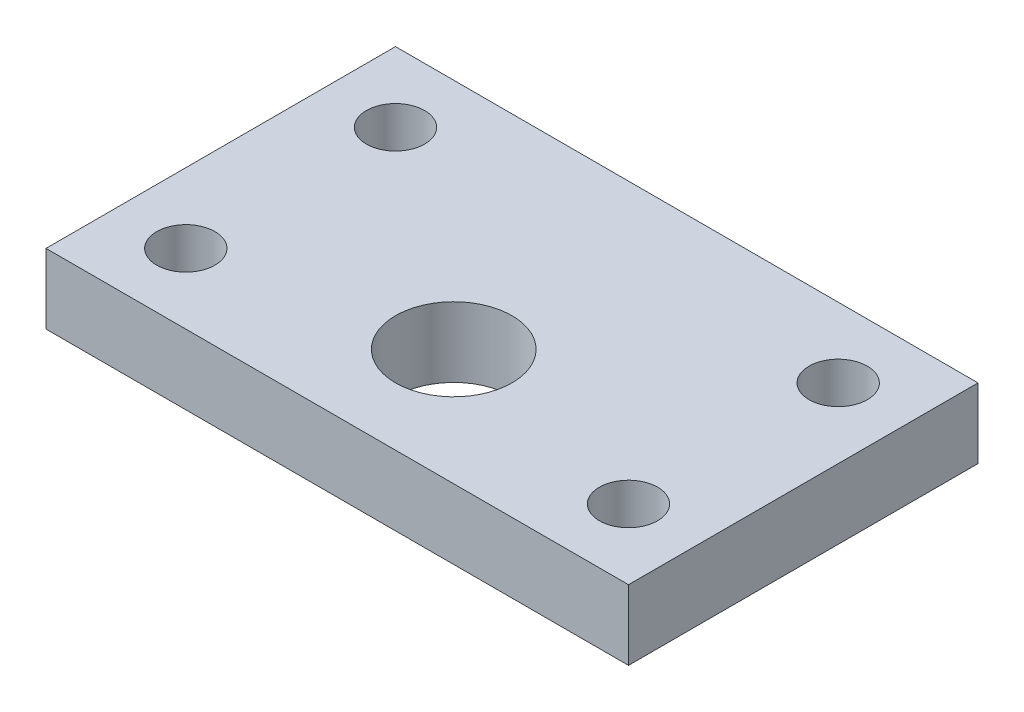
ISO-10303-21;
HEADER;
FILE_DESCRIPTION(('STEP AP214'),'2;1');
FILE_NAME('part.step','',(''),(''),'','','');
FILE_SCHEMA(('AUTOMOTIVE_DESIGN { 1 0 10303 214 1 1 1 1 }'));
ENDSEC;
DATA;
#1=APPLICATION_CONTEXT('core data for automotive mechanical design processes');
#2=APPLICATION_PROTOCOL_DEFINITION('international standard','automotive_design',2000,#1);
#3=PRODUCT_CONTEXT('',#1,'mechanical');
#4=PRODUCT('Part','Part','',(#3));
#5=PRODUCT_RELATED_PRODUCT_CATEGORY('part','',(#4));
#6=PRODUCT_DEFINITION_FORMATION('','',#4);
#7=PRODUCT_DEFINITION_CONTEXT('part definition',#1,'design');
#8=PRODUCT_DEFINITION('design','',#6,#7);
#9=PRODUCT_DEFINITION_SHAPE('','',#8);
#10=(LENGTH_UNIT() NAMED_UNIT(*) SI_UNIT(.MILLI.,.METRE.));
#11=(NAMED_UNIT(*) PLANE_ANGLE_UNIT() SI_UNIT($,.RADIAN.));
#12=(NAMED_UNIT(*) SI_UNIT($,.STERADIAN.) SOLID_ANGLE_UNIT());
#13=UNCERTAINTY_MEASURE_WITH_UNIT(LENGTH_MEASURE(1.E-05),#10,'distance_accuracy_value','');
#14=(GEOMETRIC_REPRESENTATION_CONTEXT(3) GLOBAL_UNCERTAINTY_ASSIGNED_CONTEXT((#13)) GLOBAL_UNIT_ASSIGNED_CONTEXT((#10,
#11,#12)) REPRESENTATION_CONTEXT('',''));
#15=CARTESIAN_POINT('',(0.,0.,0.));
#16=DIRECTION('',(0.,0.,1.));
#17=DIRECTION('',(1.,0.,0.));
#18=AXIS2_PLACEMENT_3D('',#15,#16,#17);
#19=CARTESIAN_POINT('',(0.,30.,0.));
#20=DIRECTION('',(0.,1.,0.));
#21=DIRECTION('',(0.,0.,1.));
#22=AXIS2_PLACEMENT_3D('',#19,#20,#21);
#23=PLANE('',#22);
#24=CARTESIAN_POINT('',(95.,30.,45.));
#25=DIRECTION('',(0.,1.,0.));
#26=DIRECTION('',(0.,0.,-1.));
#27=AXIS2_PLACEMENT_3D('',#24,#25,#26);
#28=CIRCLE('',#27,12.5);
#29=CARTESIAN_POINT('',(95.,30.,32.5));
#30=VERTEX_POINT('',#29);
#31=EDGE_CURVE('E136',#30,#30,#28,.T.);
#32=ORIENTED_EDGE('',*,*,#31,.F.);
#33=EDGE_LOOP('',(#32));
#34=FACE_BOUND('',#33,.T.);
#35=CARTESIAN_POINT('',(-95.,30.,-45.));
#36=DIRECTION('',(0.,1.,0.));
#37=DIRECTION('',(0.,0.,1.));
#38=AXIS2_PLACEMENT_3D('',#35,#36,#37);
#39=CIRCLE('',#38,12.5);
#40=CARTESIAN_POINT('',(-95.,30.,-32.5));
#41=VERTEX_POINT('',#40);
#42=EDGE_CURVE('E124',#41,#41,#39,.T.);
#43=ORIENTED_EDGE('',*,*,#42,.F.);
#44=EDGE_LOOP('',(#43));
#45=FACE_BOUND('',#44,.T.);
#46=DIRECTION('',(0.,0.,-1.));
#47=VECTOR('',#46,1.);
#48=CARTESIAN_POINT('',(125.,30.,-75.));
#49=LINE('',#48,#47);
#50=CARTESIAN_POINT('',(125.,30.,75.));
#51=VERTEX_POINT('',#50);
#52=CARTESIAN_POINT('',(125.,30.,-75.));
#53=VERTEX_POINT('',#52);
#54=EDGE_CURVE('E94',#51,#53,#49,.T.);
#55=ORIENTED_EDGE('',*,*,#54,.T.);
#56=DIRECTION('',(-1.,0.,0.));
#57=VECTOR('',#56,1.);
#58=CARTESIAN_POINT('',(-125.,30.,-75.));
#59=LINE('',#58,#57);
#60=CARTESIAN_POINT('',(-125.,30.,-75.));
#61=VERTEX_POINT('',#60);
#62=EDGE_CURVE('E89',#53,#61,#59,.T.);
#63=ORIENTED_EDGE('',*,*,#62,.T.);
#64=DIRECTION('',(0.,0.,1.));
#65=VECTOR('',#64,1.);
#66=CARTESIAN_POINT('',(-125.,30.,-75.));
#67=LINE('',#66,#65);
#68=CARTESIAN_POINT('',(-125.,30.,75.));
#69=VERTEX_POINT('',#68);
#70=EDGE_CURVE('E92',#61,#69,#67,.T.);
#71=ORIENTED_EDGE('',*,*,#70,.T.);
#72=DIRECTION('',(1.,0.,0.));
#73=VECTOR('',#72,1.);
#74=CARTESIAN_POINT('',(-125.,30.,75.));
#75=LINE('',#74,#73);
#76=EDGE_CURVE('E59',#69,#51,#75,.T.);
#77=ORIENTED_EDGE('',*,*,#76,.T.);
#78=EDGE_LOOP('',(#55,#63,#71,#77));
#79=FACE_BOUND('',#78,.T.);
#80=CARTESIAN_POINT('',(0.,30.,25.));
#81=DIRECTION('',(0.,1.,0.));
#82=DIRECTION('',(0.,0.,1.));
#83=AXIS2_PLACEMENT_3D('',#80,#81,#82);
#84=CIRCLE('',#83,25.);
#85=CARTESIAN_POINT('',(0.,30.,50.));
#86=VERTEX_POINT('',#85);
#87=EDGE_CURVE('E109',#86,#86,#84,.T.);
#88=ORIENTED_EDGE('',*,*,#87,.F.);
#89=EDGE_LOOP('',(#88));
#90=FACE_BOUND('',#89,.T.);
#91=CARTESIAN_POINT('',(-95.,30.,45.));
#92=DIRECTION('',(0.,1.,0.));
#93=DIRECTION('',(0.,0.,1.));
#94=AXIS2_PLACEMENT_3D('',#91,#92,#93);
#95=CIRCLE('',#94,12.5);
#96=CARTESIAN_POINT('',(-95.,30.,57.5));
#97=VERTEX_POINT('',#96);
#98=EDGE_CURVE('E130',#97,#97,#95,.T.);
#99=ORIENTED_EDGE('',*,*,#98,.F.);
#100=EDGE_LOOP('',(#99));
#101=FACE_BOUND('',#100,.T.);
#102=CARTESIAN_POINT('',(95.,30.,-45.));
#103=DIRECTION('',(0.,1.,0.));
#104=DIRECTION('',(0.,0.,-1.));
#105=AXIS2_PLACEMENT_3D('',#102,#103,#104);
#106=CIRCLE('',#105,12.5);
#107=CARTESIAN_POINT('',(95.,30.,-57.5));
#108=VERTEX_POINT('',#107);
#109=EDGE_CURVE('E142',#108,#108,#106,.T.);
#110=ORIENTED_EDGE('',*,*,#109,.F.);
#111=EDGE_LOOP('',(#110));
#112=FACE_BOUND('',#111,.T.);
#113=ADVANCED_FACE('F42',(#34,#45,#79,#90,#101,#112),#23,.T.);
#114=CARTESIAN_POINT('',(0.,0.,0.));
#115=DIRECTION('',(0.,1.,0.));
#116=DIRECTION('',(0.,0.,1.));
#117=AXIS2_PLACEMENT_3D('',#114,#115,#116);
#118=PLANE('',#117);
#119=DIRECTION('',(0.,0.,-1.));
#120=VECTOR('',#119,1.);
#121=CARTESIAN_POINT('',(125.,0.,-75.));
#122=LINE('',#121,#120);
#123=CARTESIAN_POINT('',(125.,0.,75.));
#124=VERTEX_POINT('',#123);
#125=CARTESIAN_POINT('',(125.,0.,-75.));
#126=VERTEX_POINT('',#125);
#127=EDGE_CURVE('E106',#124,#126,#122,.T.);
#128=ORIENTED_EDGE('',*,*,#127,.F.);
#129=DIRECTION('',(1.,0.,0.));
#130=VECTOR('',#129,1.);
#131=CARTESIAN_POINT('',(-125.,0.,75.));
#132=LINE('',#131,#130);
#133=CARTESIAN_POINT('',(-125.,0.,75.));
#134=VERTEX_POINT('',#133);
#135=EDGE_CURVE('E82',#134,#124,#132,.T.);
#136=ORIENTED_EDGE('',*,*,#135,.F.);
#137=DIRECTION('',(0.,0.,1.));
#138=VECTOR('',#137,1.);
#139=CARTESIAN_POINT('',(-125.,0.,-75.));
#140=LINE('',#139,#138);
#141=CARTESIAN_POINT('',(-125.,0.,-75.));
#142=VERTEX_POINT('',#141);
#143=EDGE_CURVE('E76',#142,#134,#140,.T.);
#144=ORIENTED_EDGE('',*,*,#143,.F.);
#145=DIRECTION('',(-1.,0.,0.));
#146=VECTOR('',#145,1.);
#147=CARTESIAN_POINT('',(-125.,0.,-75.));
#148=LINE('',#147,#146);
#149=EDGE_CURVE('E98',#126,#142,#148,.T.);
#150=ORIENTED_EDGE('',*,*,#149,.F.);
#151=EDGE_LOOP('',(#128,#136,#144,#150));
#152=FACE_BOUND('',#151,.T.);
#153=CARTESIAN_POINT('',(0.,0.,25.));
#154=DIRECTION('',(0.,1.,0.));
#155=DIRECTION('',(0.,0.,1.));
#156=AXIS2_PLACEMENT_3D('',#153,#154,#155);
#157=CIRCLE('',#156,25.);
#158=CARTESIAN_POINT('',(0.,0.,50.));
#159=VERTEX_POINT('',#158);
#160=EDGE_CURVE('E121',#159,#159,#157,.T.);
#161=ORIENTED_EDGE('',*,*,#160,.T.);
#162=EDGE_LOOP('',(#161));
#163=FACE_BOUND('',#162,.T.);
#164=CARTESIAN_POINT('',(-95.,0.,-45.));
#165=DIRECTION('',(0.,1.,0.));
#166=DIRECTION('',(0.,0.,1.));
#167=AXIS2_PLACEMENT_3D('',#164,#165,#166);
#168=CIRCLE('',#167,12.5);
#169=CARTESIAN_POINT('',(-95.,0.,-32.5));
#170=VERTEX_POINT('',#169);
#171=EDGE_CURVE('E127',#170,#170,#168,.T.);
#172=ORIENTED_EDGE('',*,*,#171,.T.);
#173=EDGE_LOOP('',(#172));
#174=FACE_BOUND('',#173,.T.);
#175=CARTESIAN_POINT('',(-95.,0.,45.));
#176=DIRECTION('',(0.,1.,0.));
#177=DIRECTION('',(0.,0.,1.));
#178=AXIS2_PLACEMENT_3D('',#175,#176,#177);
#179=CIRCLE('',#178,12.5);
#180=CARTESIAN_POINT('',(-95.,0.,57.5));
#181=VERTEX_POINT('',#180);
#182=EDGE_CURVE('E133',#181,#181,#179,.T.);
#183=ORIENTED_EDGE('',*,*,#182,.T.);
#184=EDGE_LOOP('',(#183));
#185=FACE_BOUND('',#184,.T.);
#186=CARTESIAN_POINT('',(95.,0.,45.));
#187=DIRECTION('',(0.,1.,0.));
#188=DIRECTION('',(0.,0.,-1.));
#189=AXIS2_PLACEMENT_3D('',#186,#187,#188);
#190=CIRCLE('',#189,12.5);
#191=CARTESIAN_POINT('',(95.,0.,32.5));
#192=VERTEX_POINT('',#191);
#193=EDGE_CURVE('E139',#192,#192,#190,.T.);
#194=ORIENTED_EDGE('',*,*,#193,.T.);
#195=EDGE_LOOP('',(#194));
#196=FACE_BOUND('',#195,.T.);
#197=CARTESIAN_POINT('',(95.,0.,-45.));
#198=DIRECTION('',(0.,1.,0.));
#199=DIRECTION('',(0.,0.,-1.));
#200=AXIS2_PLACEMENT_3D('',#197,#198,#199);
#201=CIRCLE('',#200,12.5);
#202=CARTESIAN_POINT('',(95.,0.,-57.5));
#203=VERTEX_POINT('',#202);
#204=EDGE_CURVE('E145',#203,#203,#201,.T.);
#205=ORIENTED_EDGE('',*,*,#204,.T.);
#206=EDGE_LOOP('',(#205));
#207=FACE_BOUND('',#206,.T.);
#208=ADVANCED_FACE('F117',(#152,#163,#174,#185,#196,#207),#118,.F.);
#209=CARTESIAN_POINT('',(125.,30.,-75.));
#210=DIRECTION('',(-1.,0.,0.));
#211=DIRECTION('',(0.,0.,1.));
#212=AXIS2_PLACEMENT_3D('',#209,#210,#211);
#213=PLANE('',#212);
#214=ORIENTED_EDGE('',*,*,#127,.T.);
#215=DIRECTION('',(0.,-1.,0.));
#216=VECTOR('',#215,1.);
#217=CARTESIAN_POINT('',(125.,30.,-75.));
#218=LINE('',#217,#216);
#219=EDGE_CURVE('E11',#53,#126,#218,.T.);
#220=ORIENTED_EDGE('',*,*,#219,.F.);
#221=ORIENTED_EDGE('',*,*,#54,.F.);
#222=DIRECTION('',(0.,-1.,0.));
#223=VECTOR('',#222,1.);
#224=CARTESIAN_POINT('',(125.,30.,75.));
#225=LINE('',#224,#223);
#226=EDGE_CURVE('E102',#51,#124,#225,.T.);
#227=ORIENTED_EDGE('',*,*,#226,.T.);
#228=EDGE_LOOP('',(#214,#220,#221,#227));
#229=FACE_BOUND('',#228,.T.);
#230=ADVANCED_FACE('F44',(#229),#213,.F.);
#231=CARTESIAN_POINT('',(-125.,30.,-75.));
#232=DIRECTION('',(0.,0.,1.));
#233=DIRECTION('',(1.,0.,0.));
#234=AXIS2_PLACEMENT_3D('',#231,#232,#233);
#235=PLANE('',#234);
#236=ORIENTED_EDGE('',*,*,#149,.T.);
#237=DIRECTION('',(0.,-1.,0.));
#238=VECTOR('',#237,1.);
#239=CARTESIAN_POINT('',(-125.,30.,-75.));
#240=LINE('',#239,#238);
#241=EDGE_CURVE('E51',#61,#142,#240,.T.);
#242=ORIENTED_EDGE('',*,*,#241,.F.);
#243=ORIENTED_EDGE('',*,*,#62,.F.);
#244=ORIENTED_EDGE('',*,*,#219,.T.);
#245=EDGE_LOOP('',(#236,#242,#243,#244));
#246=FACE_BOUND('',#245,.T.);
#247=ADVANCED_FACE('F97',(#246),#235,.F.);
#248=CARTESIAN_POINT('',(-125.,30.,-75.));
#249=DIRECTION('',(1.,0.,0.));
#250=DIRECTION('',(0.,0.,-1.));
#251=AXIS2_PLACEMENT_3D('',#248,#249,#250);
#252=PLANE('',#251);
#253=ORIENTED_EDGE('',*,*,#143,.T.);
#254=DIRECTION('',(0.,-1.,0.));
#255=VECTOR('',#254,1.);
#256=CARTESIAN_POINT('',(-125.,30.,75.));
#257=LINE('',#256,#255);
#258=EDGE_CURVE('E99',#69,#134,#257,.T.);
#259=ORIENTED_EDGE('',*,*,#258,.F.);
#260=ORIENTED_EDGE('',*,*,#70,.F.);
#261=ORIENTED_EDGE('',*,*,#241,.T.);
#262=EDGE_LOOP('',(#253,#259,#260,#261));
#263=FACE_BOUND('',#262,.T.);
#264=ADVANCED_FACE('F100',(#263),#252,.F.);
#265=CARTESIAN_POINT('',(-125.,30.,75.));
#266=DIRECTION('',(0.,0.,-1.));
#267=DIRECTION('',(-1.,0.,0.));
#268=AXIS2_PLACEMENT_3D('',#265,#266,#267);
#269=PLANE('',#268);
#270=ORIENTED_EDGE('',*,*,#135,.T.);
#271=ORIENTED_EDGE('',*,*,#226,.F.);
#272=ORIENTED_EDGE('',*,*,#76,.F.);
#273=ORIENTED_EDGE('',*,*,#258,.T.);
#274=EDGE_LOOP('',(#270,#271,#272,#273));
#275=FACE_BOUND('',#274,.T.);
#276=ADVANCED_FACE('F114',(#275),#269,.F.);
#277=CARTESIAN_POINT('',(0.,30.,25.));
#278=DIRECTION('',(0.,-1.,0.));
#279=DIRECTION('',(0.,0.,-1.));
#280=AXIS2_PLACEMENT_3D('',#277,#278,#279);
#281=CYLINDRICAL_SURFACE('',#280,25.);
#282=ORIENTED_EDGE('',*,*,#87,.T.);
#283=EDGE_LOOP('',(#282));
#284=FACE_BOUND('',#283,.T.);
#285=ORIENTED_EDGE('',*,*,#160,.F.);
#286=EDGE_LOOP('',(#285));
#287=FACE_BOUND('',#286,.T.);
#288=ADVANCED_FACE('F164',(#284,#287),#281,.F.);
#289=CARTESIAN_POINT('',(-95.,30.,-45.));
#290=DIRECTION('',(0.,-1.,0.));
#291=DIRECTION('',(0.,0.,-1.));
#292=AXIS2_PLACEMENT_3D('',#289,#290,#291);
#293=CYLINDRICAL_SURFACE('',#292,12.5);
#294=ORIENTED_EDGE('',*,*,#42,.T.);
#295=EDGE_LOOP('',(#294));
#296=FACE_BOUND('',#295,.T.);
#297=ORIENTED_EDGE('',*,*,#171,.F.);
#298=EDGE_LOOP('',(#297));
#299=FACE_BOUND('',#298,.T.);
#300=ADVANCED_FACE('F219',(#296,#299),#293,.F.);
#301=CARTESIAN_POINT('',(-95.,30.,45.));
#302=DIRECTION('',(0.,-1.,0.));
#303=DIRECTION('',(0.,0.,-1.));
#304=AXIS2_PLACEMENT_3D('',#301,#302,#303);
#305=CYLINDRICAL_SURFACE('',#304,12.5);
#306=ORIENTED_EDGE('',*,*,#98,.T.);
#307=EDGE_LOOP('',(#306));
#308=FACE_BOUND('',#307,.T.);
#309=ORIENTED_EDGE('',*,*,#182,.F.);
#310=EDGE_LOOP('',(#309));
#311=FACE_BOUND('',#310,.T.);
#312=ADVANCED_FACE('F228',(#308,#311),#305,.F.);
#313=CARTESIAN_POINT('',(95.,30.,45.));
#314=DIRECTION('',(0.,-1.,0.));
#315=DIRECTION('',(0.,0.,-1.));
#316=AXIS2_PLACEMENT_3D('',#313,#314,#315);
#317=CYLINDRICAL_SURFACE('',#316,12.5);
#318=ORIENTED_EDGE('',*,*,#31,.T.);
#319=EDGE_LOOP('',(#318));
#320=FACE_BOUND('',#319,.T.);
#321=ORIENTED_EDGE('',*,*,#193,.F.);
#322=EDGE_LOOP('',(#321));
#323=FACE_BOUND('',#322,.T.);
#324=ADVANCED_FACE('F237',(#320,#323),#317,.F.);
#325=CARTESIAN_POINT('',(95.,30.,-45.));
#326=DIRECTION('',(0.,-1.,0.));
#327=DIRECTION('',(0.,0.,-1.));
#328=AXIS2_PLACEMENT_3D('',#325,#326,#327);
#329=CYLINDRICAL_SURFACE('',#328,12.5);
#330=ORIENTED_EDGE('',*,*,#109,.T.);
#331=EDGE_LOOP('',(#330));
#332=FACE_BOUND('',#331,.T.);
#333=ORIENTED_EDGE('',*,*,#204,.F.);
#334=EDGE_LOOP('',(#333));
#335=FACE_BOUND('',#334,.T.);
#336=ADVANCED_FACE('F151',(#332,#335),#329,.F.);
#337=CLOSED_SHELL('',(#113,#208,#230,#247,#264,#276,#288,#300,#312,#324,#336));
#338=MANIFOLD_SOLID_BREP('B2',#337);
#339=ADVANCED_BREP_SHAPE_REPRESENTATION('',(#18,#338),#14);
#340=SHAPE_DEFINITION_REPRESENTATION(#9,#339);
ENDSEC;
END-ISO-10303-21;
